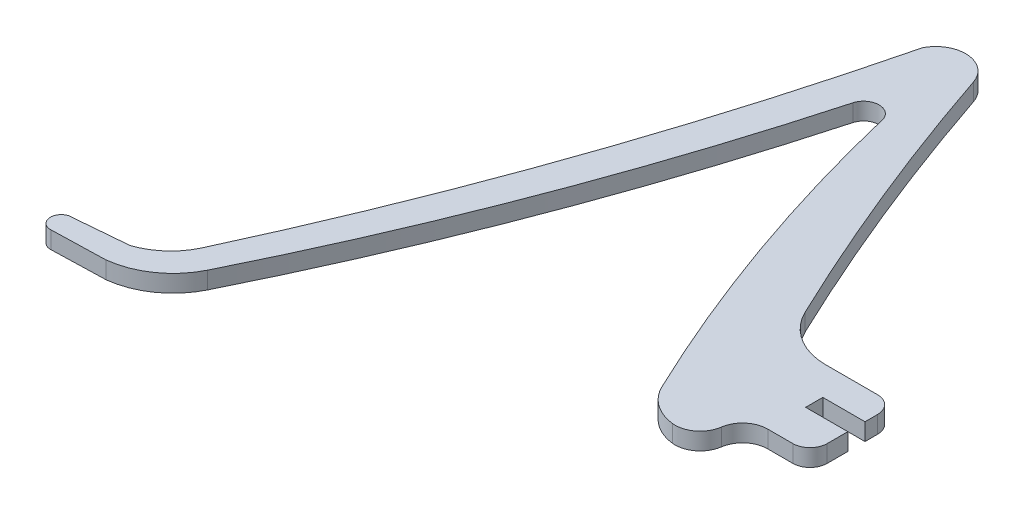
ISO-10303-21;
HEADER;
FILE_DESCRIPTION(('STEP AP214'),'2;1');
FILE_NAME('part.step','',(''),(''),'','','');
FILE_SCHEMA(('AUTOMOTIVE_DESIGN { 1 0 10303 214 1 1 1 1 }'));
ENDSEC;
DATA;
#1=APPLICATION_CONTEXT('core data for automotive mechanical design processes');
#2=APPLICATION_PROTOCOL_DEFINITION('international standard','automotive_design',2000,#1);
#3=PRODUCT_CONTEXT('',#1,'mechanical');
#4=PRODUCT('Part','Part','',(#3));
#5=PRODUCT_RELATED_PRODUCT_CATEGORY('part','',(#4));
#6=PRODUCT_DEFINITION_FORMATION('','',#4);
#7=PRODUCT_DEFINITION_CONTEXT('part definition',#1,'design');
#8=PRODUCT_DEFINITION('design','',#6,#7);
#9=PRODUCT_DEFINITION_SHAPE('','',#8);
#10=(LENGTH_UNIT() NAMED_UNIT(*) SI_UNIT(.MILLI.,.METRE.));
#11=(NAMED_UNIT(*) PLANE_ANGLE_UNIT() SI_UNIT($,.RADIAN.));
#12=(NAMED_UNIT(*) SI_UNIT($,.STERADIAN.) SOLID_ANGLE_UNIT());
#13=UNCERTAINTY_MEASURE_WITH_UNIT(LENGTH_MEASURE(1.E-05),#10,'distance_accuracy_value','');
#14=(GEOMETRIC_REPRESENTATION_CONTEXT(3) GLOBAL_UNCERTAINTY_ASSIGNED_CONTEXT((#13)) GLOBAL_UNIT_ASSIGNED_CONTEXT((#10,
#11,#12)) REPRESENTATION_CONTEXT('',''));
#15=CARTESIAN_POINT('',(0.,0.,0.));
#16=DIRECTION('',(0.,0.,1.));
#17=DIRECTION('',(1.,0.,0.));
#18=AXIS2_PLACEMENT_3D('',#15,#16,#17);
#19=CARTESIAN_POINT('',(-41738.6992189887,3.,-18363.9121093746));
#20=DIRECTION('',(0.,-1.,0.));
#21=DIRECTION('',(0.,0.,-1.));
#22=AXIS2_PLACEMENT_3D('',#19,#20,#21);
#23=CYLINDRICAL_SURFACE('',#22,1.8772510572993);
#24=CARTESIAN_POINT('',(-41738.6992189887,0.,-18363.9121093746));
#25=DIRECTION('',(0.,1.,0.));
#26=DIRECTION('',(0.,0.,1.));
#27=AXIS2_PLACEMENT_3D('',#24,#25,#26);
#28=CIRCLE('',#27,1.8772510572993);
#29=CARTESIAN_POINT('',(-41738.531777,0.,-18365.781878));
#30=VERTEX_POINT('',#29);
#31=CARTESIAN_POINT('',(-41738.64649,0.,-18362.035599));
#32=VERTEX_POINT('',#31);
#33=EDGE_CURVE('E227',#30,#32,#28,.T.);
#34=ORIENTED_EDGE('',*,*,#33,.T.);
#35=DIRECTION('',(0.,-1.,0.));
#36=VECTOR('',#35,1.);
#37=CARTESIAN_POINT('',(-41738.64649,3.,-18362.035599));
#38=LINE('',#37,#36);
#39=CARTESIAN_POINT('',(-41738.64649,3.,-18362.035599));
#40=VERTEX_POINT('',#39);
#41=EDGE_CURVE('E11',#40,#32,#38,.T.);
#42=ORIENTED_EDGE('',*,*,#41,.F.);
#43=CARTESIAN_POINT('',(-41738.6992189887,3.,-18363.9121093746));
#44=DIRECTION('',(0.,1.,0.));
#45=DIRECTION('',(0.,0.,1.));
#46=AXIS2_PLACEMENT_3D('',#43,#44,#45);
#47=CIRCLE('',#46,1.8772510572993);
#48=CARTESIAN_POINT('',(-41738.531777,3.,-18365.781878));
#49=VERTEX_POINT('',#48);
#50=EDGE_CURVE('E273',#49,#40,#47,.T.);
#51=ORIENTED_EDGE('',*,*,#50,.F.);
#52=DIRECTION('',(0.,-1.,0.));
#53=VECTOR('',#52,1.);
#54=CARTESIAN_POINT('',(-41738.531777,3.,-18365.781878));
#55=LINE('',#54,#53);
#56=EDGE_CURVE('E223',#49,#30,#55,.T.);
#57=ORIENTED_EDGE('',*,*,#56,.T.);
#58=EDGE_LOOP('',(#34,#42,#51,#57));
#59=FACE_BOUND('',#58,.T.);
#60=ADVANCED_FACE('F35',(#59),#23,.T.);
#61=CARTESIAN_POINT('',(-41738.64649,3.,-18362.035599));
#62=DIRECTION('',(-0.0281516893864438,0.,-0.999603662650697));
#63=DIRECTION('',(-0.999603662650697,0.,0.0281516893864438));
#64=AXIS2_PLACEMENT_3D('',#61,#62,#63);
#65=PLANE('',#64);
#66=DIRECTION('',(0.999603662650697,0.,-0.0281516893864438));
#67=VECTOR('',#66,1.);
#68=CARTESIAN_POINT('',(-41738.64649,0.,-18362.035599));
#69=LINE('',#68,#67);
#70=CARTESIAN_POINT('',(-41729.230469,0.,-18362.300781));
#71=VERTEX_POINT('',#70);
#72=EDGE_CURVE('E230',#32,#71,#69,.T.);
#73=ORIENTED_EDGE('',*,*,#72,.T.);
#74=DIRECTION('',(0.,-1.,0.));
#75=VECTOR('',#74,1.);
#76=CARTESIAN_POINT('',(-41729.230469,3.,-18362.300781));
#77=LINE('',#76,#75);
#78=CARTESIAN_POINT('',(-41729.230469,3.,-18362.300781));
#79=VERTEX_POINT('',#78);
#80=EDGE_CURVE('E43',#79,#71,#77,.T.);
#81=ORIENTED_EDGE('',*,*,#80,.F.);
#82=DIRECTION('',(0.999603662650697,0.,-0.0281516893864438));
#83=VECTOR('',#82,1.);
#84=CARTESIAN_POINT('',(-41738.64649,3.,-18362.035599));
#85=LINE('',#84,#83);
#86=EDGE_CURVE('E142',#40,#79,#85,.T.);
#87=ORIENTED_EDGE('',*,*,#86,.F.);
#88=ORIENTED_EDGE('',*,*,#41,.T.);
#89=EDGE_LOOP('',(#73,#81,#87,#88));
#90=FACE_BOUND('',#89,.T.);
#91=ADVANCED_FACE('F411',(#90),#65,.F.);
#92=CARTESIAN_POINT('',(-41730.7724777594,3.,-18375.5045827002));
#93=DIRECTION('',(0.,-1.,0.));
#94=DIRECTION('',(0.,0.,-1.));
#95=AXIS2_PLACEMENT_3D('',#92,#93,#94);
#96=CYLINDRICAL_SURFACE('',#95,13.2935386693008);
#97=CARTESIAN_POINT('',(-41730.7724777594,0.,-18375.5045827002));
#98=DIRECTION('',(0.,1.,0.));
#99=DIRECTION('',(0.,0.,1.));
#100=AXIS2_PLACEMENT_3D('',#97,#98,#99);
#101=CIRCLE('',#100,13.2935386693008);
#102=CARTESIAN_POINT('',(-41718.850758,0.,-18369.623191));
#103=VERTEX_POINT('',#102);
#104=EDGE_CURVE('E232',#71,#103,#101,.T.);
#105=ORIENTED_EDGE('',*,*,#104,.T.);
#106=DIRECTION('',(0.,-1.,0.));
#107=VECTOR('',#106,1.);
#108=CARTESIAN_POINT('',(-41718.850758,3.,-18369.623191));
#109=LINE('',#108,#107);
#110=CARTESIAN_POINT('',(-41718.850758,3.,-18369.623191));
#111=VERTEX_POINT('',#110);
#112=EDGE_CURVE('E328',#111,#103,#109,.T.);
#113=ORIENTED_EDGE('',*,*,#112,.F.);
#114=CARTESIAN_POINT('',(-41730.7724777594,3.,-18375.5045827002));
#115=DIRECTION('',(0.,1.,0.));
#116=DIRECTION('',(0.,0.,1.));
#117=AXIS2_PLACEMENT_3D('',#114,#115,#116);
#118=CIRCLE('',#117,13.2935386693008);
#119=EDGE_CURVE('E336',#79,#111,#118,.T.);
#120=ORIENTED_EDGE('',*,*,#119,.F.);
#121=ORIENTED_EDGE('',*,*,#80,.T.);
#122=EDGE_LOOP('',(#105,#113,#120,#121));
#123=FACE_BOUND('',#122,.T.);
#124=ADVANCED_FACE('F334',(#123),#96,.T.);
#125=CARTESIAN_POINT('',(-42131.7479660176,3.,-18573.2269802959));
#126=DIRECTION('',(0.,-1.,0.));
#127=DIRECTION('',(0.,0.,-1.));
#128=AXIS2_PLACEMENT_3D('',#125,#126,#127);
#129=CYLINDRICAL_SURFACE('',#128,460.367904402997);
#130=CARTESIAN_POINT('',(-42131.7479660176,0.,-18573.2269802959));
#131=DIRECTION('',(0.,1.,0.));
#132=DIRECTION('',(0.,0.,1.));
#133=AXIS2_PLACEMENT_3D('',#130,#131,#132);
#134=CIRCLE('',#133,460.367904402997);
#135=CARTESIAN_POINT('',(-41687.841823,0.,-18451.2190150001));
#136=VERTEX_POINT('',#135);
#137=EDGE_CURVE('E234',#103,#136,#134,.T.);
#138=ORIENTED_EDGE('',*,*,#137,.T.);
#139=DIRECTION('',(0.,-1.,0.));
#140=VECTOR('',#139,1.);
#141=CARTESIAN_POINT('',(-41687.841823,3.,-18451.2190150001));
#142=LINE('',#141,#140);
#143=CARTESIAN_POINT('',(-41687.841823,3.,-18451.2190150001));
#144=VERTEX_POINT('',#143);
#145=EDGE_CURVE('E325',#144,#136,#142,.T.);
#146=ORIENTED_EDGE('',*,*,#145,.F.);
#147=CARTESIAN_POINT('',(-42131.7479660176,3.,-18573.2269802959));
#148=DIRECTION('',(0.,1.,0.));
#149=DIRECTION('',(0.,0.,1.));
#150=AXIS2_PLACEMENT_3D('',#147,#148,#149);
#151=CIRCLE('',#150,460.367904402997);
#152=EDGE_CURVE('E354',#111,#144,#151,.T.);
#153=ORIENTED_EDGE('',*,*,#152,.F.);
#154=ORIENTED_EDGE('',*,*,#112,.T.);
#155=EDGE_LOOP('',(#138,#146,#153,#154));
#156=FACE_BOUND('',#155,.T.);
#157=ADVANCED_FACE('F345',(#156),#129,.T.);
#158=CARTESIAN_POINT('',(-41685.247483446,3.,-18450.5038166306));
#159=DIRECTION('',(0.,-1.,0.));
#160=DIRECTION('',(0.,0.,-1.));
#161=AXIS2_PLACEMENT_3D('',#158,#159,#160);
#162=CYLINDRICAL_SURFACE('',#161,2.69111620509593);
#163=CARTESIAN_POINT('',(-41685.247483446,0.,-18450.5038166306));
#164=DIRECTION('',(0.,-1.,0.));
#165=DIRECTION('',(0.,0.,1.));
#166=AXIS2_PLACEMENT_3D('',#163,#164,#165);
#167=CIRCLE('',#166,2.69111620509593);
#168=CARTESIAN_POINT('',(-41682.766146,0.,-18451.545484));
#169=VERTEX_POINT('',#168);
#170=EDGE_CURVE('E236',#136,#169,#167,.T.);
#171=ORIENTED_EDGE('',*,*,#170,.T.);
#172=DIRECTION('',(0.,-1.,0.));
#173=VECTOR('',#172,1.);
#174=CARTESIAN_POINT('',(-41682.766146,3.,-18451.545484));
#175=LINE('',#174,#173);
#176=CARTESIAN_POINT('',(-41682.766146,3.,-18451.545484));
#177=VERTEX_POINT('',#176);
#178=EDGE_CURVE('E322',#177,#169,#175,.T.);
#179=ORIENTED_EDGE('',*,*,#178,.F.);
#180=CARTESIAN_POINT('',(-41685.247483446,3.,-18450.5038166306));
#181=DIRECTION('',(0.,-1.,0.));
#182=DIRECTION('',(0.,0.,1.));
#183=AXIS2_PLACEMENT_3D('',#180,#181,#182);
#184=CIRCLE('',#183,2.69111620509593);
#185=EDGE_CURVE('E351',#144,#177,#184,.T.);
#186=ORIENTED_EDGE('',*,*,#185,.F.);
#187=ORIENTED_EDGE('',*,*,#145,.T.);
#188=EDGE_LOOP('',(#171,#179,#186,#187));
#189=FACE_BOUND('',#188,.T.);
#190=ADVANCED_FACE('F349',(#189),#162,.F.);
#191=CARTESIAN_POINT('',(-41390.6482191059,3.,-18521.1719345968));
#192=DIRECTION('',(0.,-1.,0.));
#193=DIRECTION('',(0.,0.,-1.));
#194=AXIS2_PLACEMENT_3D('',#191,#192,#193);
#195=CYLINDRICAL_SURFACE('',#194,300.301058665503);
#196=CARTESIAN_POINT('',(-41390.6482191059,0.,-18521.1719345968));
#197=DIRECTION('',(0.,1.,0.));
#198=DIRECTION('',(0.,0.,1.));
#199=AXIS2_PLACEMENT_3D('',#196,#197,#198);
#200=CIRCLE('',#199,300.301058665503);
#201=CARTESIAN_POINT('',(-41661.5612450001,0.,-18391.607826));
#202=VERTEX_POINT('',#201);
#203=EDGE_CURVE('E238',#169,#202,#200,.T.);
#204=ORIENTED_EDGE('',*,*,#203,.T.);
#205=DIRECTION('',(0.,-1.,0.));
#206=VECTOR('',#205,1.);
#207=CARTESIAN_POINT('',(-41661.5612450001,3.,-18391.607826));
#208=LINE('',#207,#206);
#209=CARTESIAN_POINT('',(-41661.5612450001,3.,-18391.607826));
#210=VERTEX_POINT('',#209);
#211=EDGE_CURVE('E319',#210,#202,#208,.T.);
#212=ORIENTED_EDGE('',*,*,#211,.F.);
#213=CARTESIAN_POINT('',(-41390.6482191059,3.,-18521.1719345968));
#214=DIRECTION('',(0.,1.,0.));
#215=DIRECTION('',(0.,0.,1.));
#216=AXIS2_PLACEMENT_3D('',#213,#214,#215);
#217=CIRCLE('',#216,300.301058665503);
#218=EDGE_CURVE('E353',#177,#210,#217,.T.);
#219=ORIENTED_EDGE('',*,*,#218,.F.);
#220=ORIENTED_EDGE('',*,*,#178,.T.);
#221=EDGE_LOOP('',(#204,#212,#219,#220));
#222=FACE_BOUND('',#221,.T.);
#223=ADVANCED_FACE('F424',(#222),#195,.T.);
#224=CARTESIAN_POINT('',(-41654.1774722383,3.,-18395.1398811102));
#225=DIRECTION('',(0.,-1.,0.));
#226=DIRECTION('',(0.,0.,-1.));
#227=AXIS2_PLACEMENT_3D('',#224,#225,#226);
#228=CYLINDRICAL_SURFACE('',#227,8.18507871059851);
#229=CARTESIAN_POINT('',(-41654.1774722383,0.,-18395.1398811102));
#230=DIRECTION('',(0.,1.,0.));
#231=DIRECTION('',(0.,0.,1.));
#232=AXIS2_PLACEMENT_3D('',#229,#230,#231);
#233=CIRCLE('',#232,8.18507871059851);
#234=CARTESIAN_POINT('',(-41655.13076,0.,-18387.0105049999));
#235=VERTEX_POINT('',#234);
#236=EDGE_CURVE('E240',#202,#235,#233,.T.);
#237=ORIENTED_EDGE('',*,*,#236,.T.);
#238=DIRECTION('',(0.,-1.,0.));
#239=VECTOR('',#238,1.);
#240=CARTESIAN_POINT('',(-41655.13076,3.,-18387.0105049999));
#241=LINE('',#240,#239);
#242=CARTESIAN_POINT('',(-41655.13076,3.,-18387.0105049999));
#243=VERTEX_POINT('',#242);
#244=EDGE_CURVE('E316',#243,#235,#241,.T.);
#245=ORIENTED_EDGE('',*,*,#244,.F.);
#246=CARTESIAN_POINT('',(-41654.1774722383,3.,-18395.1398811102));
#247=DIRECTION('',(0.,1.,0.));
#248=DIRECTION('',(0.,0.,1.));
#249=AXIS2_PLACEMENT_3D('',#246,#247,#248);
#250=CIRCLE('',#249,8.18507871059851);
#251=EDGE_CURVE('E356',#210,#243,#250,.T.);
#252=ORIENTED_EDGE('',*,*,#251,.F.);
#253=ORIENTED_EDGE('',*,*,#211,.T.);
#254=EDGE_LOOP('',(#237,#245,#252,#253));
#255=FACE_BOUND('',#254,.T.);
#256=ADVANCED_FACE('F427',(#255),#228,.T.);
#257=CARTESIAN_POINT('',(-41654.621781205,3.,-18391.3510327665));
#258=DIRECTION('',(0.,-1.,0.));
#259=DIRECTION('',(0.,0.,-1.));
#260=AXIS2_PLACEMENT_3D('',#257,#258,#259);
#261=CYLINDRICAL_SURFACE('',#260,4.37026780710188);
#262=CARTESIAN_POINT('',(-41654.621781205,0.,-18391.3510327665));
#263=DIRECTION('',(0.,1.,0.));
#264=DIRECTION('',(0.,0.,1.));
#265=AXIS2_PLACEMENT_3D('',#262,#263,#264);
#266=CIRCLE('',#265,4.37026780710188);
#267=CARTESIAN_POINT('',(-41650.295225,0.,-18390.734468));
#268=VERTEX_POINT('',#267);
#269=EDGE_CURVE('E242',#235,#268,#266,.T.);
#270=ORIENTED_EDGE('',*,*,#269,.T.);
#271=DIRECTION('',(0.,-1.,0.));
#272=VECTOR('',#271,1.);
#273=CARTESIAN_POINT('',(-41650.295225,3.,-18390.734468));
#274=LINE('',#273,#272);
#275=CARTESIAN_POINT('',(-41650.295225,3.,-18390.734468));
#276=VERTEX_POINT('',#275);
#277=EDGE_CURVE('E313',#276,#268,#274,.T.);
#278=ORIENTED_EDGE('',*,*,#277,.F.);
#279=CARTESIAN_POINT('',(-41654.621781205,3.,-18391.3510327665));
#280=DIRECTION('',(0.,1.,0.));
#281=DIRECTION('',(0.,0.,1.));
#282=AXIS2_PLACEMENT_3D('',#279,#280,#281);
#283=CIRCLE('',#282,4.37026780710188);
#284=EDGE_CURVE('E362',#243,#276,#283,.T.);
#285=ORIENTED_EDGE('',*,*,#284,.F.);
#286=ORIENTED_EDGE('',*,*,#244,.T.);
#287=EDGE_LOOP('',(#270,#278,#285,#286));
#288=FACE_BOUND('',#287,.T.);
#289=ADVANCED_FACE('F431',(#288),#261,.T.);
#290=CARTESIAN_POINT('',(-41645.9821666567,3.,-18390.1176820744));
#291=DIRECTION('',(0.,-1.,0.));
#292=DIRECTION('',(0.,0.,-1.));
#293=AXIS2_PLACEMENT_3D('',#290,#291,#292);
#294=CYLINDRICAL_SURFACE('',#293,4.35693667053058);
#295=CARTESIAN_POINT('',(-41645.9821666567,0.,-18390.1176820744));
#296=DIRECTION('',(0.,-1.,0.));
#297=DIRECTION('',(0.,0.,1.));
#298=AXIS2_PLACEMENT_3D('',#295,#296,#297);
#299=CIRCLE('',#298,4.35693667053058);
#300=CARTESIAN_POINT('',(-41645.943257,0.,-18394.4744449999));
#301=VERTEX_POINT('',#300);
#302=EDGE_CURVE('E244',#268,#301,#299,.T.);
#303=ORIENTED_EDGE('',*,*,#302,.T.);
#304=DIRECTION('',(0.,-1.,0.));
#305=VECTOR('',#304,1.);
#306=CARTESIAN_POINT('',(-41645.943257,3.,-18394.4744449999));
#307=LINE('',#306,#305);
#308=CARTESIAN_POINT('',(-41645.943257,3.,-18394.4744449999));
#309=VERTEX_POINT('',#308);
#310=EDGE_CURVE('E310',#309,#301,#307,.T.);
#311=ORIENTED_EDGE('',*,*,#310,.F.);
#312=CARTESIAN_POINT('',(-41645.9821666567,3.,-18390.1176820744));
#313=DIRECTION('',(0.,-1.,0.));
#314=DIRECTION('',(0.,0.,1.));
#315=AXIS2_PLACEMENT_3D('',#312,#313,#314);
#316=CIRCLE('',#315,4.35693667053058);
#317=EDGE_CURVE('E364',#276,#309,#316,.T.);
#318=ORIENTED_EDGE('',*,*,#317,.F.);
#319=ORIENTED_EDGE('',*,*,#277,.T.);
#320=EDGE_LOOP('',(#303,#311,#318,#319));
#321=FACE_BOUND('',#320,.T.);
#322=ADVANCED_FACE('F435',(#321),#294,.F.);
#323=CARTESIAN_POINT('',(-41645.943257,3.,-18394.4744449999));
#324=DIRECTION('',(-0.000484113065643185,0.,-0.999999882817263));
#325=DIRECTION('',(-0.999999882817263,0.,0.000484113065643185));
#326=AXIS2_PLACEMENT_3D('',#323,#324,#325);
#327=PLANE('',#326);
#328=DIRECTION('',(0.999999882817263,0.,-0.000484113065643185));
#329=VECTOR('',#328,1.);
#330=CARTESIAN_POINT('',(-41645.943257,0.,-18394.4744449999));
#331=LINE('',#330,#329);
#332=CARTESIAN_POINT('',(-41641.570312,0.,-18394.476562));
#333=VERTEX_POINT('',#332);
#334=EDGE_CURVE('E246',#301,#333,#331,.T.);
#335=ORIENTED_EDGE('',*,*,#334,.T.);
#336=DIRECTION('',(0.,-1.,0.));
#337=VECTOR('',#336,1.);
#338=CARTESIAN_POINT('',(-41641.570312,3.,-18394.476562));
#339=LINE('',#338,#337);
#340=CARTESIAN_POINT('',(-41641.570312,3.,-18394.476562));
#341=VERTEX_POINT('',#340);
#342=EDGE_CURVE('E307',#341,#333,#339,.T.);
#343=ORIENTED_EDGE('',*,*,#342,.F.);
#344=DIRECTION('',(0.999999882817263,0.,-0.000484113065643185));
#345=VECTOR('',#344,1.);
#346=CARTESIAN_POINT('',(-41645.943257,3.,-18394.4744449999));
#347=LINE('',#346,#345);
#348=EDGE_CURVE('E366',#309,#341,#347,.T.);
#349=ORIENTED_EDGE('',*,*,#348,.F.);
#350=ORIENTED_EDGE('',*,*,#310,.T.);
#351=EDGE_LOOP('',(#335,#343,#349,#350));
#352=FACE_BOUND('',#351,.T.);
#353=ADVANCED_FACE('F439',(#352),#327,.F.);
#354=CARTESIAN_POINT('',(-41641.5703122996,3.,-18397.4765617002));
#355=DIRECTION('',(0.,-1.,0.));
#356=DIRECTION('',(0.,0.,-1.));
#357=AXIS2_PLACEMENT_3D('',#354,#355,#356);
#358=CYLINDRICAL_SURFACE('',#357,2.99999970020241);
#359=CARTESIAN_POINT('',(-41641.5703122996,0.,-18397.4765617002));
#360=DIRECTION('',(0.,1.,0.));
#361=DIRECTION('',(0.,0.,1.));
#362=AXIS2_PLACEMENT_3D('',#359,#360,#361);
#363=CIRCLE('',#362,2.99999970020241);
#364=CARTESIAN_POINT('',(-41638.570313,0.,-18397.478112));
#365=VERTEX_POINT('',#364);
#366=EDGE_CURVE('E248',#333,#365,#363,.T.);
#367=ORIENTED_EDGE('',*,*,#366,.T.);
#368=DIRECTION('',(0.,-1.,0.));
#369=VECTOR('',#368,1.);
#370=CARTESIAN_POINT('',(-41638.570313,3.,-18397.478112));
#371=LINE('',#370,#369);
#372=CARTESIAN_POINT('',(-41638.570313,3.,-18397.478112));
#373=VERTEX_POINT('',#372);
#374=EDGE_CURVE('E304',#373,#365,#371,.T.);
#375=ORIENTED_EDGE('',*,*,#374,.F.);
#376=CARTESIAN_POINT('',(-41641.5703122996,3.,-18397.4765617002));
#377=DIRECTION('',(0.,1.,0.));
#378=DIRECTION('',(0.,0.,1.));
#379=AXIS2_PLACEMENT_3D('',#376,#377,#378);
#380=CIRCLE('',#379,2.99999970020241);
#381=EDGE_CURVE('E368',#341,#373,#380,.T.);
#382=ORIENTED_EDGE('',*,*,#381,.F.);
#383=ORIENTED_EDGE('',*,*,#342,.T.);
#384=EDGE_LOOP('',(#367,#375,#382,#383));
#385=FACE_BOUND('',#384,.T.);
#386=ADVANCED_FACE('F443',(#385),#358,.T.);
#387=CARTESIAN_POINT('',(-41638.570313,3.,-18397.478112));
#388=DIRECTION('',(-0.999999999999961,0.,-2.78067644508323E-07));
#389=DIRECTION('',(-2.78067644508323E-07,0.,0.999999999999961));
#390=AXIS2_PLACEMENT_3D('',#387,#388,#389);
#391=PLANE('',#390);
#392=DIRECTION('',(2.78067644508323E-07,0.,-0.999999999999961));
#393=VECTOR('',#392,1.);
#394=CARTESIAN_POINT('',(-41638.570313,0.,-18397.478112));
#395=LINE('',#394,#393);
#396=CARTESIAN_POINT('',(-41638.570312,0.,-18401.074219));
#397=VERTEX_POINT('',#396);
#398=EDGE_CURVE('E250',#365,#397,#395,.T.);
#399=ORIENTED_EDGE('',*,*,#398,.T.);
#400=DIRECTION('',(0.,-1.,0.));
#401=VECTOR('',#400,1.);
#402=CARTESIAN_POINT('',(-41638.570312,3.,-18401.074219));
#403=LINE('',#402,#401);
#404=CARTESIAN_POINT('',(-41638.570312,3.,-18401.074219));
#405=VERTEX_POINT('',#404);
#406=EDGE_CURVE('E301',#405,#397,#403,.T.);
#407=ORIENTED_EDGE('',*,*,#406,.F.);
#408=DIRECTION('',(2.78067644508323E-07,0.,-0.999999999999961));
#409=VECTOR('',#408,1.);
#410=CARTESIAN_POINT('',(-41638.570313,3.,-18397.478112));
#411=LINE('',#410,#409);
#412=EDGE_CURVE('E370',#373,#405,#411,.T.);
#413=ORIENTED_EDGE('',*,*,#412,.F.);
#414=ORIENTED_EDGE('',*,*,#374,.T.);
#415=EDGE_LOOP('',(#399,#407,#413,#414));
#416=FACE_BOUND('',#415,.T.);
#417=ADVANCED_FACE('F447',(#416),#391,.F.);
#418=CARTESIAN_POINT('',(-41638.570312,3.,-18401.074219));
#419=DIRECTION('',(0.,0.,1.));
#420=DIRECTION('',(1.,0.,0.));
#421=AXIS2_PLACEMENT_3D('',#418,#419,#420);
#422=PLANE('',#421);
#423=DIRECTION('',(-1.,0.,0.));
#424=VECTOR('',#423,1.);
#425=CARTESIAN_POINT('',(-41638.570312,0.,-18401.074219));
#426=LINE('',#425,#424);
#427=CARTESIAN_POINT('',(-41645.933594,0.,-18401.074219));
#428=VERTEX_POINT('',#427);
#429=EDGE_CURVE('E252',#397,#428,#426,.T.);
#430=ORIENTED_EDGE('',*,*,#429,.T.);
#431=DIRECTION('',(0.,-1.,0.));
#432=VECTOR('',#431,1.);
#433=CARTESIAN_POINT('',(-41645.933594,3.,-18401.074219));
#434=LINE('',#433,#432);
#435=CARTESIAN_POINT('',(-41645.933594,3.,-18401.074219));
#436=VERTEX_POINT('',#435);
#437=EDGE_CURVE('E298',#436,#428,#434,.T.);
#438=ORIENTED_EDGE('',*,*,#437,.F.);
#439=DIRECTION('',(-1.,0.,0.));
#440=VECTOR('',#439,1.);
#441=CARTESIAN_POINT('',(-41638.570312,3.,-18401.074219));
#442=LINE('',#441,#440);
#443=EDGE_CURVE('E372',#405,#436,#442,.T.);
#444=ORIENTED_EDGE('',*,*,#443,.F.);
#445=ORIENTED_EDGE('',*,*,#406,.T.);
#446=EDGE_LOOP('',(#430,#438,#444,#445));
#447=FACE_BOUND('',#446,.T.);
#448=ADVANCED_FACE('F451',(#447),#422,.F.);
#449=CARTESIAN_POINT('',(-41645.933594,3.,-18401.074219));
#450=DIRECTION('',(-0.999999152399079,0.,0.00130199889520163));
#451=DIRECTION('',(0.00130199889520163,0.,0.999999152399079));
#452=AXIS2_PLACEMENT_3D('',#449,#450,#451);
#453=PLANE('',#452);
#454=DIRECTION('',(-0.00130199889520163,0.,-0.999999152399079));
#455=VECTOR('',#454,1.);
#456=CARTESIAN_POINT('',(-41645.933594,0.,-18401.074219));
#457=LINE('',#456,#455);
#458=CARTESIAN_POINT('',(-41645.9375,0.,-18404.074219));
#459=VERTEX_POINT('',#458);
#460=EDGE_CURVE('E254',#428,#459,#457,.T.);
#461=ORIENTED_EDGE('',*,*,#460,.T.);
#462=DIRECTION('',(0.,-1.,0.));
#463=VECTOR('',#462,1.);
#464=CARTESIAN_POINT('',(-41645.9375,3.,-18404.074219));
#465=LINE('',#464,#463);
#466=CARTESIAN_POINT('',(-41645.9375,3.,-18404.074219));
#467=VERTEX_POINT('',#466);
#468=EDGE_CURVE('E295',#467,#459,#465,.T.);
#469=ORIENTED_EDGE('',*,*,#468,.F.);
#470=DIRECTION('',(-0.00130199889520163,0.,-0.999999152399079));
#471=VECTOR('',#470,1.);
#472=CARTESIAN_POINT('',(-41645.933594,3.,-18401.074219));
#473=LINE('',#472,#471);
#474=EDGE_CURVE('E374',#436,#467,#473,.T.);
#475=ORIENTED_EDGE('',*,*,#474,.F.);
#476=ORIENTED_EDGE('',*,*,#437,.T.);
#477=EDGE_LOOP('',(#461,#469,#475,#476));
#478=FACE_BOUND('',#477,.T.);
#479=ADVANCED_FACE('F455',(#478),#453,.F.);
#480=CARTESIAN_POINT('',(-41645.9375,3.,-18404.074219));
#481=DIRECTION('',(0.,0.,-1.));
#482=DIRECTION('',(-1.,0.,0.));
#483=AXIS2_PLACEMENT_3D('',#480,#481,#482);
#484=PLANE('',#483);
#485=DIRECTION('',(1.,0.,0.));
#486=VECTOR('',#485,1.);
#487=CARTESIAN_POINT('',(-41645.9375,0.,-18404.074219));
#488=LINE('',#487,#486);
#489=CARTESIAN_POINT('',(-41638.574219,0.,-18404.074219));
#490=VERTEX_POINT('',#489);
#491=EDGE_CURVE('E256',#459,#490,#488,.T.);
#492=ORIENTED_EDGE('',*,*,#491,.T.);
#493=DIRECTION('',(0.,-1.,0.));
#494=VECTOR('',#493,1.);
#495=CARTESIAN_POINT('',(-41638.574219,3.,-18404.074219));
#496=LINE('',#495,#494);
#497=CARTESIAN_POINT('',(-41638.574219,3.,-18404.074219));
#498=VERTEX_POINT('',#497);
#499=EDGE_CURVE('E292',#498,#490,#496,.T.);
#500=ORIENTED_EDGE('',*,*,#499,.F.);
#501=DIRECTION('',(1.,0.,0.));
#502=VECTOR('',#501,1.);
#503=CARTESIAN_POINT('',(-41645.9375,3.,-18404.074219));
#504=LINE('',#503,#502);
#505=EDGE_CURVE('E376',#467,#498,#504,.T.);
#506=ORIENTED_EDGE('',*,*,#505,.F.);
#507=ORIENTED_EDGE('',*,*,#468,.T.);
#508=EDGE_LOOP('',(#492,#500,#506,#507));
#509=FACE_BOUND('',#508,.T.);
#510=ADVANCED_FACE('F459',(#509),#484,.F.);
#511=CARTESIAN_POINT('',(-41638.574219,3.,-18404.074219));
#512=DIRECTION('',(-0.999998399290962,0.,-0.0017892499866031));
#513=DIRECTION('',(-0.0017892499866031,0.,0.999998399290962));
#514=AXIS2_PLACEMENT_3D('',#511,#512,#513);
#515=PLANE('',#514);
#516=DIRECTION('',(0.0017892499866031,0.,-0.999998399290962));
#517=VECTOR('',#516,1.);
#518=CARTESIAN_POINT('',(-41638.574219,0.,-18404.074219));
#519=LINE('',#518,#517);
#520=CARTESIAN_POINT('',(-41638.570312,0.,-18406.257812));
#521=VERTEX_POINT('',#520);
#522=EDGE_CURVE('E258',#490,#521,#519,.T.);
#523=ORIENTED_EDGE('',*,*,#522,.T.);
#524=DIRECTION('',(0.,-1.,0.));
#525=VECTOR('',#524,1.);
#526=CARTESIAN_POINT('',(-41638.570312,3.,-18406.257812));
#527=LINE('',#526,#525);
#528=CARTESIAN_POINT('',(-41638.570312,3.,-18406.257812));
#529=VERTEX_POINT('',#528);
#530=EDGE_CURVE('E289',#529,#521,#527,.T.);
#531=ORIENTED_EDGE('',*,*,#530,.F.);
#532=DIRECTION('',(0.0017892499866031,0.,-0.999998399290962));
#533=VECTOR('',#532,1.);
#534=CARTESIAN_POINT('',(-41638.574219,3.,-18404.074219));
#535=LINE('',#534,#533);
#536=EDGE_CURVE('E378',#498,#529,#535,.T.);
#537=ORIENTED_EDGE('',*,*,#536,.F.);
#538=ORIENTED_EDGE('',*,*,#499,.T.);
#539=EDGE_LOOP('',(#523,#531,#537,#538));
#540=FACE_BOUND('',#539,.T.);
#541=ADVANCED_FACE('F463',(#540),#515,.F.);
#542=CARTESIAN_POINT('',(-41641.5722642296,3.,-18406.2558597721));
#543=DIRECTION('',(0.,-1.,0.));
#544=DIRECTION('',(0.,0.,-1.));
#545=AXIS2_PLACEMENT_3D('',#542,#543,#544);
#546=CYLINDRICAL_SURFACE('',#545,3.00195286439714);
#547=CARTESIAN_POINT('',(-41641.5722642296,0.,-18406.2558597721));
#548=DIRECTION('',(0.,1.,0.));
#549=DIRECTION('',(0.,0.,1.));
#550=AXIS2_PLACEMENT_3D('',#547,#548,#549);
#551=CIRCLE('',#550,3.00195286439714);
#552=CARTESIAN_POINT('',(-41641.574219,0.,-18409.2578120001));
#553=VERTEX_POINT('',#552);
#554=EDGE_CURVE('E260',#521,#553,#551,.T.);
#555=ORIENTED_EDGE('',*,*,#554,.T.);
#556=DIRECTION('',(0.,-1.,0.));
#557=VECTOR('',#556,1.);
#558=CARTESIAN_POINT('',(-41641.574219,3.,-18409.2578120001));
#559=LINE('',#558,#557);
#560=CARTESIAN_POINT('',(-41641.574219,3.,-18409.2578120001));
#561=VERTEX_POINT('',#560);
#562=EDGE_CURVE('E286',#561,#553,#559,.T.);
#563=ORIENTED_EDGE('',*,*,#562,.F.);
#564=CARTESIAN_POINT('',(-41641.5722642296,3.,-18406.2558597721));
#565=DIRECTION('',(0.,1.,0.));
#566=DIRECTION('',(0.,0.,1.));
#567=AXIS2_PLACEMENT_3D('',#564,#565,#566);
#568=CIRCLE('',#567,3.00195286439714);
#569=EDGE_CURVE('E380',#529,#561,#568,.T.);
#570=ORIENTED_EDGE('',*,*,#569,.F.);
#571=ORIENTED_EDGE('',*,*,#530,.T.);
#572=EDGE_LOOP('',(#555,#563,#570,#571));
#573=FACE_BOUND('',#572,.T.);
#574=ADVANCED_FACE('F467',(#573),#546,.T.);
#575=CARTESIAN_POINT('',(-41641.574219,3.,-18409.2578120001));
#576=DIRECTION('',(0.000209982367281959,0.,0.999999977953702));
#577=DIRECTION('',(0.999999977953703,0.,-0.000209982367281959));
#578=AXIS2_PLACEMENT_3D('',#575,#576,#577);
#579=PLANE('',#578);
#580=DIRECTION('',(-0.999999977953702,0.,0.000209982367281959));
#581=VECTOR('',#580,1.);
#582=CARTESIAN_POINT('',(-41641.574219,0.,-18409.2578120001));
#583=LINE('',#582,#581);
#584=CARTESIAN_POINT('',(-41650.875,0.,-18409.255859));
#585=VERTEX_POINT('',#584);
#586=EDGE_CURVE('E262',#553,#585,#583,.T.);
#587=ORIENTED_EDGE('',*,*,#586,.T.);
#588=DIRECTION('',(0.,-1.,0.));
#589=VECTOR('',#588,1.);
#590=CARTESIAN_POINT('',(-41650.875,3.,-18409.255859));
#591=LINE('',#590,#589);
#592=CARTESIAN_POINT('',(-41650.875,3.,-18409.255859));
#593=VERTEX_POINT('',#592);
#594=EDGE_CURVE('E283',#593,#585,#591,.T.);
#595=ORIENTED_EDGE('',*,*,#594,.F.);
#596=DIRECTION('',(-0.999999977953702,0.,0.000209982367281959));
#597=VECTOR('',#596,1.);
#598=CARTESIAN_POINT('',(-41641.574219,3.,-18409.2578120001));
#599=LINE('',#598,#597);
#600=EDGE_CURVE('E382',#561,#593,#599,.T.);
#601=ORIENTED_EDGE('',*,*,#600,.F.);
#602=ORIENTED_EDGE('',*,*,#562,.T.);
#603=EDGE_LOOP('',(#587,#595,#601,#602));
#604=FACE_BOUND('',#603,.T.);
#605=ADVANCED_FACE('F471',(#604),#579,.F.);
#606=CARTESIAN_POINT('',(-41650.5723416209,3.,-18420.1081544222));
#607=DIRECTION('',(0.,-1.,0.));
#608=DIRECTION('',(0.,0.,-1.));
#609=AXIS2_PLACEMENT_3D('',#606,#607,#608);
#610=CYLINDRICAL_SURFACE('',#609,10.8565150036903);
#611=CARTESIAN_POINT('',(-41650.5723416209,0.,-18420.1081544222));
#612=DIRECTION('',(0.,-1.,0.));
#613=DIRECTION('',(0.,0.,1.));
#614=AXIS2_PLACEMENT_3D('',#611,#612,#613);
#615=CIRCLE('',#614,10.8565150036903);
#616=CARTESIAN_POINT('',(-41660.3681950002,0.,-18415.4278580002));
#617=VERTEX_POINT('',#616);
#618=EDGE_CURVE('E264',#585,#617,#615,.T.);
#619=ORIENTED_EDGE('',*,*,#618,.T.);
#620=DIRECTION('',(0.,-1.,0.));
#621=VECTOR('',#620,1.);
#622=CARTESIAN_POINT('',(-41660.3681950002,3.,-18415.4278580002));
#623=LINE('',#622,#621);
#624=CARTESIAN_POINT('',(-41660.3681950002,3.,-18415.4278580002));
#625=VERTEX_POINT('',#624);
#626=EDGE_CURVE('E280',#625,#617,#623,.T.);
#627=ORIENTED_EDGE('',*,*,#626,.F.);
#628=CARTESIAN_POINT('',(-41650.5723416209,3.,-18420.1081544222));
#629=DIRECTION('',(0.,-1.,0.));
#630=DIRECTION('',(0.,0.,1.));
#631=AXIS2_PLACEMENT_3D('',#628,#629,#630);
#632=CIRCLE('',#631,10.8565150036903);
#633=EDGE_CURVE('E384',#593,#625,#632,.T.);
#634=ORIENTED_EDGE('',*,*,#633,.F.);
#635=ORIENTED_EDGE('',*,*,#594,.T.);
#636=EDGE_LOOP('',(#619,#627,#634,#635));
#637=FACE_BOUND('',#636,.T.);
#638=ADVANCED_FACE('F475',(#637),#610,.F.);
#639=CARTESIAN_POINT('',(-41258.7053210126,3.,-18607.4295335133));
#640=DIRECTION('',(0.,-1.,0.));
#641=DIRECTION('',(0.,0.,-1.));
#642=AXIS2_PLACEMENT_3D('',#639,#640,#641);
#643=CYLINDRICAL_SURFACE('',#642,445.1940113476);
#644=CARTESIAN_POINT('',(-41258.7053210126,0.,-18607.4295335133));
#645=DIRECTION('',(0.,-1.,0.));
#646=DIRECTION('',(0.,0.,1.));
#647=AXIS2_PLACEMENT_3D('',#644,#645,#646);
#648=CIRCLE('',#647,445.1940113476);
#649=CARTESIAN_POINT('',(-41680.482514,0.,-18464.9454739997));
#650=VERTEX_POINT('',#649);
#651=EDGE_CURVE('E266',#617,#650,#648,.T.);
#652=ORIENTED_EDGE('',*,*,#651,.T.);
#653=DIRECTION('',(0.,-1.,0.));
#654=VECTOR('',#653,1.);
#655=CARTESIAN_POINT('',(-41680.482514,3.,-18464.9454739997));
#656=LINE('',#655,#654);
#657=CARTESIAN_POINT('',(-41680.482514,3.,-18464.9454739997));
#658=VERTEX_POINT('',#657);
#659=EDGE_CURVE('E277',#658,#650,#656,.T.);
#660=ORIENTED_EDGE('',*,*,#659,.F.);
#661=CARTESIAN_POINT('',(-41258.7053210126,3.,-18607.4295335133));
#662=DIRECTION('',(0.,-1.,0.));
#663=DIRECTION('',(0.,0.,1.));
#664=AXIS2_PLACEMENT_3D('',#661,#662,#663);
#665=CIRCLE('',#664,445.1940113476);
#666=EDGE_CURVE('E386',#625,#658,#665,.T.);
#667=ORIENTED_EDGE('',*,*,#666,.F.);
#668=ORIENTED_EDGE('',*,*,#626,.T.);
#669=EDGE_LOOP('',(#652,#660,#667,#668));
#670=FACE_BOUND('',#669,.T.);
#671=ADVANCED_FACE('F392',(#670),#643,.F.);
#672=CARTESIAN_POINT('',(-41685.4289242258,3.,-18463.2733799547));
#673=DIRECTION('',(0.,-1.,0.));
#674=DIRECTION('',(0.,0.,-1.));
#675=AXIS2_PLACEMENT_3D('',#672,#673,#674);
#676=CYLINDRICAL_SURFACE('',#675,5.22138608200061);
#677=CARTESIAN_POINT('',(-41685.4289242258,0.,-18463.2733799547));
#678=DIRECTION('',(0.,1.,0.));
#679=DIRECTION('',(0.,0.,1.));
#680=AXIS2_PLACEMENT_3D('',#677,#678,#679);
#681=CIRCLE('',#680,5.22138608200061);
#682=CARTESIAN_POINT('',(-41690.071601,0.,-18465.6626109999));
#683=VERTEX_POINT('',#682);
#684=EDGE_CURVE('E268',#650,#683,#681,.T.);
#685=ORIENTED_EDGE('',*,*,#684,.T.);
#686=DIRECTION('',(0.,-1.,0.));
#687=VECTOR('',#686,1.);
#688=CARTESIAN_POINT('',(-41690.071601,3.,-18465.6626109999));
#689=LINE('',#688,#687);
#690=CARTESIAN_POINT('',(-41690.071601,3.,-18465.6626109999));
#691=VERTEX_POINT('',#690);
#692=EDGE_CURVE('E218',#691,#683,#689,.T.);
#693=ORIENTED_EDGE('',*,*,#692,.F.);
#694=CARTESIAN_POINT('',(-41685.4289242258,3.,-18463.2733799547));
#695=DIRECTION('',(0.,1.,0.));
#696=DIRECTION('',(0.,0.,1.));
#697=AXIS2_PLACEMENT_3D('',#694,#695,#696);
#698=CIRCLE('',#697,5.22138608200061);
#699=EDGE_CURVE('E209',#658,#691,#698,.T.);
#700=ORIENTED_EDGE('',*,*,#699,.F.);
#701=ORIENTED_EDGE('',*,*,#659,.T.);
#702=EDGE_LOOP('',(#685,#693,#700,#701));
#703=FACE_BOUND('',#702,.T.);
#704=ADVANCED_FACE('F396',(#703),#676,.T.);
#705=CARTESIAN_POINT('',(-42191.3702686894,3.,-18588.9521432362));
#706=DIRECTION('',(0.,-1.,0.));
#707=DIRECTION('',(0.,0.,-1.));
#708=AXIS2_PLACEMENT_3D('',#705,#706,#707);
#709=CYLINDRICAL_SURFACE('',#708,516.237022099576);
#710=CARTESIAN_POINT('',(-42191.3702686894,0.,-18588.9521432362));
#711=DIRECTION('',(0.,-1.,0.));
#712=DIRECTION('',(0.,0.,1.));
#713=AXIS2_PLACEMENT_3D('',#710,#711,#712);
#714=CIRCLE('',#713,516.237022099576);
#715=CARTESIAN_POINT('',(-41722.771896,0.,-18372.350601));
#716=VERTEX_POINT('',#715);
#717=EDGE_CURVE('E217',#683,#716,#714,.T.);
#718=ORIENTED_EDGE('',*,*,#717,.T.);
#719=DIRECTION('',(0.,-1.,0.));
#720=VECTOR('',#719,1.);
#721=CARTESIAN_POINT('',(-41722.771896,3.,-18372.350601));
#722=LINE('',#721,#720);
#723=CARTESIAN_POINT('',(-41722.771896,3.,-18372.350601));
#724=VERTEX_POINT('',#723);
#725=EDGE_CURVE('E214',#724,#716,#722,.T.);
#726=ORIENTED_EDGE('',*,*,#725,.F.);
#727=CARTESIAN_POINT('',(-42191.3702686894,3.,-18588.9521432362));
#728=DIRECTION('',(0.,-1.,0.));
#729=DIRECTION('',(0.,0.,1.));
#730=AXIS2_PLACEMENT_3D('',#727,#728,#729);
#731=CIRCLE('',#730,516.237022099576);
#732=EDGE_CURVE('E203',#691,#724,#731,.T.);
#733=ORIENTED_EDGE('',*,*,#732,.F.);
#734=ORIENTED_EDGE('',*,*,#692,.T.);
#735=EDGE_LOOP('',(#718,#726,#733,#734));
#736=FACE_BOUND('',#735,.T.);
#737=ADVANCED_FACE('F215',(#736),#709,.F.);
#738=CARTESIAN_POINT('',(-41732.8780562716,3.,-18377.2326852499));
#739=DIRECTION('',(0.,-1.,0.));
#740=DIRECTION('',(0.,0.,-1.));
#741=AXIS2_PLACEMENT_3D('',#738,#739,#740);
#742=CYLINDRICAL_SURFACE('',#741,11.2236011181003);
#743=CARTESIAN_POINT('',(-41732.8780562716,0.,-18377.2326852499));
#744=DIRECTION('',(0.,-1.,0.));
#745=DIRECTION('',(0.,0.,1.));
#746=AXIS2_PLACEMENT_3D('',#743,#744,#745);
#747=CIRCLE('',#746,11.2236011181003);
#748=CARTESIAN_POINT('',(-41729.360433,0.,-18366.574564));
#749=VERTEX_POINT('',#748);
#750=EDGE_CURVE('E128',#716,#749,#747,.T.);
#751=ORIENTED_EDGE('',*,*,#750,.T.);
#752=DIRECTION('',(0.,-1.,0.));
#753=VECTOR('',#752,1.);
#754=CARTESIAN_POINT('',(-41729.360433,3.,-18366.574564));
#755=LINE('',#754,#753);
#756=CARTESIAN_POINT('',(-41729.360433,3.,-18366.574564));
#757=VERTEX_POINT('',#756);
#758=EDGE_CURVE('E219',#757,#749,#755,.T.);
#759=ORIENTED_EDGE('',*,*,#758,.F.);
#760=CARTESIAN_POINT('',(-41732.8780562716,3.,-18377.2326852499));
#761=DIRECTION('',(0.,-1.,0.));
#762=DIRECTION('',(0.,0.,1.));
#763=AXIS2_PLACEMENT_3D('',#760,#761,#762);
#764=CIRCLE('',#763,11.2236011181003);
#765=EDGE_CURVE('E207',#724,#757,#764,.T.);
#766=ORIENTED_EDGE('',*,*,#765,.F.);
#767=ORIENTED_EDGE('',*,*,#725,.T.);
#768=EDGE_LOOP('',(#751,#759,#766,#767));
#769=FACE_BOUND('',#768,.T.);
#770=ADVANCED_FACE('F221',(#769),#742,.F.);
#771=CARTESIAN_POINT('',(-41729.360433,3.,-18366.574564));
#772=DIRECTION('',(0.0861097016820911,0.,0.996285661482801));
#773=DIRECTION('',(0.996285661482801,0.,-0.0861097016820911));
#774=AXIS2_PLACEMENT_3D('',#771,#772,#773);
#775=PLANE('',#774);
#776=DIRECTION('',(-0.9962856614828,0.,0.0861097016820911));
#777=VECTOR('',#776,1.);
#778=CARTESIAN_POINT('',(-41729.360433,0.,-18366.574564));
#779=LINE('',#778,#777);
#780=EDGE_CURVE('E134',#749,#30,#779,.T.);
#781=ORIENTED_EDGE('',*,*,#780,.T.);
#782=ORIENTED_EDGE('',*,*,#56,.F.);
#783=DIRECTION('',(-0.9962856614828,0.,0.0861097016820911));
#784=VECTOR('',#783,1.);
#785=CARTESIAN_POINT('',(-41729.360433,3.,-18366.574564));
#786=LINE('',#785,#784);
#787=EDGE_CURVE('E51',#757,#49,#786,.T.);
#788=ORIENTED_EDGE('',*,*,#787,.F.);
#789=ORIENTED_EDGE('',*,*,#758,.T.);
#790=EDGE_LOOP('',(#781,#782,#788,#789));
#791=FACE_BOUND('',#790,.T.);
#792=ADVANCED_FACE('F400',(#791),#775,.F.);
#793=CARTESIAN_POINT('',(-41738.6992189887,3.,-18363.9121093746));
#794=DIRECTION('',(0.,1.,0.));
#795=DIRECTION('',(0.,0.,1.));
#796=AXIS2_PLACEMENT_3D('',#793,#794,#795);
#797=PLANE('',#796);
#798=ORIENTED_EDGE('',*,*,#50,.T.);
#799=ORIENTED_EDGE('',*,*,#86,.T.);
#800=ORIENTED_EDGE('',*,*,#119,.T.);
#801=ORIENTED_EDGE('',*,*,#152,.T.);
#802=ORIENTED_EDGE('',*,*,#185,.T.);
#803=ORIENTED_EDGE('',*,*,#218,.T.);
#804=ORIENTED_EDGE('',*,*,#251,.T.);
#805=ORIENTED_EDGE('',*,*,#284,.T.);
#806=ORIENTED_EDGE('',*,*,#317,.T.);
#807=ORIENTED_EDGE('',*,*,#348,.T.);
#808=ORIENTED_EDGE('',*,*,#381,.T.);
#809=ORIENTED_EDGE('',*,*,#412,.T.);
#810=ORIENTED_EDGE('',*,*,#443,.T.);
#811=ORIENTED_EDGE('',*,*,#474,.T.);
#812=ORIENTED_EDGE('',*,*,#505,.T.);
#813=ORIENTED_EDGE('',*,*,#536,.T.);
#814=ORIENTED_EDGE('',*,*,#569,.T.);
#815=ORIENTED_EDGE('',*,*,#600,.T.);
#816=ORIENTED_EDGE('',*,*,#633,.T.);
#817=ORIENTED_EDGE('',*,*,#666,.T.);
#818=ORIENTED_EDGE('',*,*,#699,.T.);
#819=ORIENTED_EDGE('',*,*,#732,.T.);
#820=ORIENTED_EDGE('',*,*,#765,.T.);
#821=ORIENTED_EDGE('',*,*,#787,.T.);
#822=EDGE_LOOP('',(#798,#799,#800,#801,#802,#803,#804,#805,#806,#807,#808,#809,#810,#811,#812,
#813,#814,#815,#816,#817,#818,#819,#820,#821));
#823=FACE_BOUND('',#822,.T.);
#824=ADVANCED_FACE('F205',(#823),#797,.T.);
#825=CARTESIAN_POINT('',(-41738.6992189887,0.,-18363.9121093746));
#826=DIRECTION('',(0.,1.,0.));
#827=DIRECTION('',(0.,0.,1.));
#828=AXIS2_PLACEMENT_3D('',#825,#826,#827);
#829=PLANE('',#828);
#830=ORIENTED_EDGE('',*,*,#33,.F.);
#831=ORIENTED_EDGE('',*,*,#780,.F.);
#832=ORIENTED_EDGE('',*,*,#750,.F.);
#833=ORIENTED_EDGE('',*,*,#717,.F.);
#834=ORIENTED_EDGE('',*,*,#684,.F.);
#835=ORIENTED_EDGE('',*,*,#651,.F.);
#836=ORIENTED_EDGE('',*,*,#618,.F.);
#837=ORIENTED_EDGE('',*,*,#586,.F.);
#838=ORIENTED_EDGE('',*,*,#554,.F.);
#839=ORIENTED_EDGE('',*,*,#522,.F.);
#840=ORIENTED_EDGE('',*,*,#491,.F.);
#841=ORIENTED_EDGE('',*,*,#460,.F.);
#842=ORIENTED_EDGE('',*,*,#429,.F.);
#843=ORIENTED_EDGE('',*,*,#398,.F.);
#844=ORIENTED_EDGE('',*,*,#366,.F.);
#845=ORIENTED_EDGE('',*,*,#334,.F.);
#846=ORIENTED_EDGE('',*,*,#302,.F.);
#847=ORIENTED_EDGE('',*,*,#269,.F.);
#848=ORIENTED_EDGE('',*,*,#236,.F.);
#849=ORIENTED_EDGE('',*,*,#203,.F.);
#850=ORIENTED_EDGE('',*,*,#170,.F.);
#851=ORIENTED_EDGE('',*,*,#137,.F.);
#852=ORIENTED_EDGE('',*,*,#104,.F.);
#853=ORIENTED_EDGE('',*,*,#72,.F.);
#854=EDGE_LOOP('',(#830,#831,#832,#833,#834,#835,#836,#837,#838,#839,#840,#841,#842,#843,#844,
#845,#846,#847,#848,#849,#850,#851,#852,#853));
#855=FACE_BOUND('',#854,.T.);
#856=ADVANCED_FACE('F340',(#855),#829,.F.);
#857=CLOSED_SHELL('',(#60,#91,#124,#157,#190,#223,#256,#289,#322,#353,#386,#417,#448,#479,#510,
#541,#574,#605,#638,#671,#704,#737,#770,#792,#824,#856));
#858=MANIFOLD_SOLID_BREP('B2',#857);
#859=ADVANCED_BREP_SHAPE_REPRESENTATION('',(#18,#858),#14);
#860=SHAPE_DEFINITION_REPRESENTATION(#9,#859);
ENDSEC;
END-ISO-10303-21;
